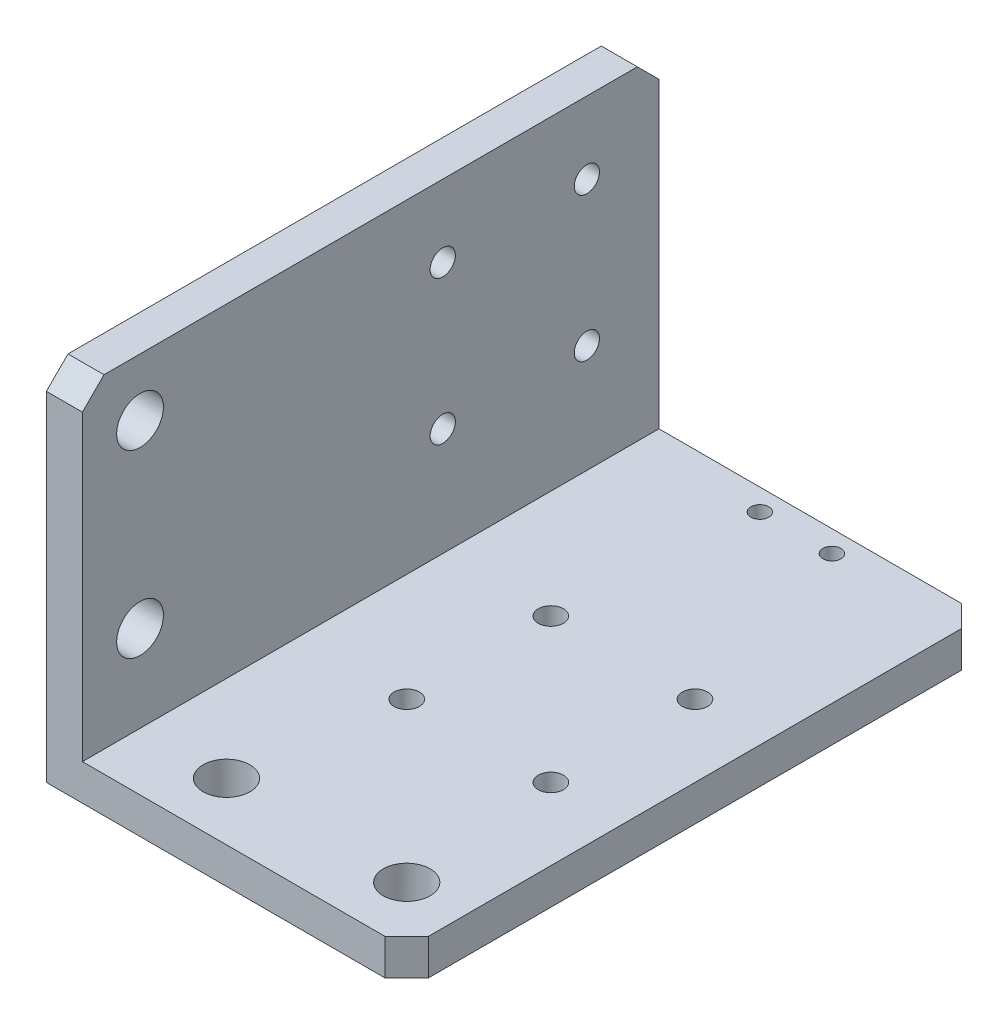
ISO-10303-21;
HEADER;
FILE_DESCRIPTION(('STEP AP214'),'2;1');
FILE_NAME('part.step','',(''),(''),'','','');
FILE_SCHEMA(('AUTOMOTIVE_DESIGN { 1 0 10303 214 1 1 1 1 }'));
ENDSEC;
DATA;
#1=APPLICATION_CONTEXT('core data for automotive mechanical design processes');
#2=APPLICATION_PROTOCOL_DEFINITION('international standard','automotive_design',2000,#1);
#3=PRODUCT_CONTEXT('',#1,'mechanical');
#4=PRODUCT('Part','Part','',(#3));
#5=PRODUCT_RELATED_PRODUCT_CATEGORY('part','',(#4));
#6=PRODUCT_DEFINITION_FORMATION('','',#4);
#7=PRODUCT_DEFINITION_CONTEXT('part definition',#1,'design');
#8=PRODUCT_DEFINITION('design','',#6,#7);
#9=PRODUCT_DEFINITION_SHAPE('','',#8);
#10=(LENGTH_UNIT() NAMED_UNIT(*) SI_UNIT(.MILLI.,.METRE.));
#11=(NAMED_UNIT(*) PLANE_ANGLE_UNIT() SI_UNIT($,.RADIAN.));
#12=(NAMED_UNIT(*) SI_UNIT($,.STERADIAN.) SOLID_ANGLE_UNIT());
#13=UNCERTAINTY_MEASURE_WITH_UNIT(LENGTH_MEASURE(1.E-05),#10,'distance_accuracy_value','');
#14=(GEOMETRIC_REPRESENTATION_CONTEXT(3) GLOBAL_UNCERTAINTY_ASSIGNED_CONTEXT((#13)) GLOBAL_UNIT_ASSIGNED_CONTEXT((#10,
#11,#12)) REPRESENTATION_CONTEXT('',''));
#15=CARTESIAN_POINT('',(0.,0.,0.));
#16=DIRECTION('',(0.,0.,1.));
#17=DIRECTION('',(1.,0.,0.));
#18=AXIS2_PLACEMENT_3D('',#15,#16,#17);
#19=CARTESIAN_POINT('',(50.,0.,80.));
#20=DIRECTION('',(0.,1.,0.));
#21=DIRECTION('',(-1.,0.,0.));
#22=AXIS2_PLACEMENT_3D('',#19,#20,#21);
#23=PLANE('',#22);
#24=CARTESIAN_POINT('',(22.,0.,3.));
#25=DIRECTION('',(0.,1.,0.));
#26=DIRECTION('',(-1.,0.,0.));
#27=AXIS2_PLACEMENT_3D('',#24,#25,#26);
#28=CIRCLE('',#27,1.25);
#29=CARTESIAN_POINT('',(20.75,0.,3.));
#30=VERTEX_POINT('',#29);
#31=EDGE_CURVE('E311',#30,#30,#28,.F.);
#32=ORIENTED_EDGE('',*,*,#31,.F.);
#33=EDGE_LOOP('',(#32));
#34=FACE_BOUND('',#33,.T.);
#35=CARTESIAN_POINT('',(32.,0.,3.));
#36=DIRECTION('',(0.,1.,0.));
#37=DIRECTION('',(-1.,0.,0.));
#38=AXIS2_PLACEMENT_3D('',#35,#36,#37);
#39=CIRCLE('',#38,1.25);
#40=CARTESIAN_POINT('',(30.75,0.,3.));
#41=VERTEX_POINT('',#40);
#42=EDGE_CURVE('E305',#41,#41,#39,.F.);
#43=ORIENTED_EDGE('',*,*,#42,.F.);
#44=EDGE_LOOP('',(#43));
#45=FACE_BOUND('',#44,.T.);
#46=CARTESIAN_POINT('',(40.0000000000001,0.,30.0000000000001));
#47=DIRECTION('',(0.,-1.,0.));
#48=DIRECTION('',(1.,0.,0.));
#49=AXIS2_PLACEMENT_3D('',#46,#47,#48);
#50=CIRCLE('',#49,1.75000000000001);
#51=CARTESIAN_POINT('',(41.7500000000001,0.,30.0000000000001));
#52=VERTEX_POINT('',#51);
#53=EDGE_CURVE('E302',#52,#52,#50,.T.);
#54=ORIENTED_EDGE('',*,*,#53,.F.);
#55=EDGE_LOOP('',(#54));
#56=FACE_BOUND('',#55,.T.);
#57=CARTESIAN_POINT('',(39.9999999999999,0.,50.0000000000001));
#58=DIRECTION('',(0.,-1.,0.));
#59=DIRECTION('',(1.,0.,0.));
#60=AXIS2_PLACEMENT_3D('',#57,#58,#59);
#61=CIRCLE('',#60,1.75);
#62=CARTESIAN_POINT('',(41.7499999999999,0.,50.0000000000001));
#63=VERTEX_POINT('',#62);
#64=EDGE_CURVE('E296',#63,#63,#61,.T.);
#65=ORIENTED_EDGE('',*,*,#64,.F.);
#66=EDGE_LOOP('',(#65));
#67=FACE_BOUND('',#66,.T.);
#68=CARTESIAN_POINT('',(19.9999999999999,0.,49.9999999999999));
#69=DIRECTION('',(0.,-1.,0.));
#70=DIRECTION('',(1.,0.,0.));
#71=AXIS2_PLACEMENT_3D('',#68,#69,#70);
#72=CIRCLE('',#71,1.75);
#73=CARTESIAN_POINT('',(21.7499999999999,0.,49.9999999999999));
#74=VERTEX_POINT('',#73);
#75=EDGE_CURVE('E290',#74,#74,#72,.T.);
#76=ORIENTED_EDGE('',*,*,#75,.F.);
#77=EDGE_LOOP('',(#76));
#78=FACE_BOUND('',#77,.T.);
#79=CARTESIAN_POINT('',(20.0000000000001,0.,29.9999999999999));
#80=DIRECTION('',(0.,-1.,0.));
#81=DIRECTION('',(1.,0.,0.));
#82=AXIS2_PLACEMENT_3D('',#79,#80,#81);
#83=CIRCLE('',#82,1.75);
#84=CARTESIAN_POINT('',(21.7500000000001,0.,29.9999999999999));
#85=VERTEX_POINT('',#84);
#86=EDGE_CURVE('E284',#85,#85,#83,.T.);
#87=ORIENTED_EDGE('',*,*,#86,.F.);
#88=EDGE_LOOP('',(#87));
#89=FACE_BOUND('',#88,.T.);
#90=CARTESIAN_POINT('',(17.,0.,72.));
#91=DIRECTION('',(0.,-1.,0.));
#92=DIRECTION('',(0.,0.,-1.));
#93=AXIS2_PLACEMENT_3D('',#90,#91,#92);
#94=CIRCLE('',#93,3.24999999999999);
#95=CARTESIAN_POINT('',(17.,0.,68.75));
#96=VERTEX_POINT('',#95);
#97=EDGE_CURVE('E242',#96,#96,#94,.T.);
#98=ORIENTED_EDGE('',*,*,#97,.F.);
#99=EDGE_LOOP('',(#98));
#100=FACE_BOUND('',#99,.T.);
#101=CARTESIAN_POINT('',(42.,0.,72.));
#102=DIRECTION('',(0.,-1.,0.));
#103=DIRECTION('',(0.,0.,-1.));
#104=AXIS2_PLACEMENT_3D('',#101,#102,#103);
#105=CIRCLE('',#104,3.24999999999999);
#106=CARTESIAN_POINT('',(42.,0.,68.75));
#107=VERTEX_POINT('',#106);
#108=EDGE_CURVE('E236',#107,#107,#105,.T.);
#109=ORIENTED_EDGE('',*,*,#108,.F.);
#110=EDGE_LOOP('',(#109));
#111=FACE_BOUND('',#110,.T.);
#112=DIRECTION('',(1.,0.,0.));
#113=VECTOR('',#112,1.);
#114=CARTESIAN_POINT('',(50.,0.,0.));
#115=LINE('',#114,#113);
#116=CARTESIAN_POINT('',(0.,0.,0.));
#117=VERTEX_POINT('',#116);
#118=CARTESIAN_POINT('',(47.,0.,0.));
#119=VERTEX_POINT('',#118);
#120=EDGE_CURVE('E160',#117,#119,#115,.T.);
#121=ORIENTED_EDGE('',*,*,#120,.T.);
#122=DIRECTION('',(0.707106781186548,0.,0.707106781186548));
#123=VECTOR('',#122,1.);
#124=CARTESIAN_POINT('',(50.,0.,3.00000000000002));
#125=LINE('',#124,#123);
#126=CARTESIAN_POINT('',(50.,0.,3.00000000000004));
#127=VERTEX_POINT('',#126);
#128=EDGE_CURVE('E205',#119,#127,#125,.T.);
#129=ORIENTED_EDGE('',*,*,#128,.T.);
#130=DIRECTION('',(0.,0.,-1.));
#131=VECTOR('',#130,1.);
#132=CARTESIAN_POINT('',(50.,0.,80.));
#133=LINE('',#132,#131);
#134=CARTESIAN_POINT('',(50.,0.,77.));
#135=VERTEX_POINT('',#134);
#136=EDGE_CURVE('E177',#135,#127,#133,.T.);
#137=ORIENTED_EDGE('',*,*,#136,.F.);
#138=DIRECTION('',(0.707106781186544,0.,-0.707106781186551));
#139=VECTOR('',#138,1.);
#140=CARTESIAN_POINT('',(47.,0.,80.));
#141=LINE('',#140,#139);
#142=CARTESIAN_POINT('',(47.,0.,80.));
#143=VERTEX_POINT('',#142);
#144=EDGE_CURVE('E64',#135,#143,#141,.F.);
#145=ORIENTED_EDGE('',*,*,#144,.T.);
#146=DIRECTION('',(1.,0.,0.));
#147=VECTOR('',#146,1.);
#148=CARTESIAN_POINT('',(50.,0.,80.));
#149=LINE('',#148,#147);
#150=CARTESIAN_POINT('',(0.,0.,80.));
#151=VERTEX_POINT('',#150);
#152=EDGE_CURVE('E136',#151,#143,#149,.T.);
#153=ORIENTED_EDGE('',*,*,#152,.F.);
#154=DIRECTION('',(0.,0.,-1.));
#155=VECTOR('',#154,1.);
#156=CARTESIAN_POINT('',(0.,0.,80.));
#157=LINE('',#156,#155);
#158=EDGE_CURVE('E156',#151,#117,#157,.T.);
#159=ORIENTED_EDGE('',*,*,#158,.T.);
#160=EDGE_LOOP('',(#121,#129,#137,#145,#153,#159));
#161=FACE_BOUND('',#160,.T.);
#162=ADVANCED_FACE('F49',(#34,#45,#56,#67,#78,#89,#100,#111,#161),#23,.F.);
#163=CARTESIAN_POINT('',(50.,5.,80.));
#164=DIRECTION('',(-1.,0.,0.));
#165=DIRECTION('',(0.,0.,1.));
#166=AXIS2_PLACEMENT_3D('',#163,#164,#165);
#167=PLANE('',#166);
#168=ORIENTED_EDGE('',*,*,#136,.T.);
#169=DIRECTION('',(0.,1.,0.));
#170=VECTOR('',#169,1.);
#171=CARTESIAN_POINT('',(50.,5.,3.00000000000002));
#172=LINE('',#171,#170);
#173=CARTESIAN_POINT('',(50.,5.,3.00000000000004));
#174=VERTEX_POINT('',#173);
#175=EDGE_CURVE('E198',#127,#174,#172,.T.);
#176=ORIENTED_EDGE('',*,*,#175,.T.);
#177=DIRECTION('',(0.,0.,-1.));
#178=VECTOR('',#177,1.);
#179=CARTESIAN_POINT('',(50.,5.,80.));
#180=LINE('',#179,#178);
#181=CARTESIAN_POINT('',(50.,5.,77.));
#182=VERTEX_POINT('',#181);
#183=EDGE_CURVE('E147',#182,#174,#180,.T.);
#184=ORIENTED_EDGE('',*,*,#183,.F.);
#185=DIRECTION('',(0.,-1.,0.));
#186=VECTOR('',#185,1.);
#187=CARTESIAN_POINT('',(50.,5.,77.));
#188=LINE('',#187,#186);
#189=EDGE_CURVE('E196',#182,#135,#188,.T.);
#190=ORIENTED_EDGE('',*,*,#189,.T.);
#191=EDGE_LOOP('',(#168,#176,#184,#190));
#192=FACE_BOUND('',#191,.T.);
#193=ADVANCED_FACE('F212',(#192),#167,.F.);
#194=CARTESIAN_POINT('',(5.00000000000001,5.,80.));
#195=DIRECTION('',(0.,-1.,0.));
#196=DIRECTION('',(1.,0.,0.));
#197=AXIS2_PLACEMENT_3D('',#194,#195,#196);
#198=PLANE('',#197);
#199=CARTESIAN_POINT('',(22.,5.,3.));
#200=DIRECTION('',(0.,1.,0.));
#201=DIRECTION('',(-1.,0.,0.));
#202=AXIS2_PLACEMENT_3D('',#199,#200,#201);
#203=CIRCLE('',#202,1.25);
#204=CARTESIAN_POINT('',(20.75,5.,3.));
#205=VERTEX_POINT('',#204);
#206=EDGE_CURVE('E314',#205,#205,#203,.T.);
#207=ORIENTED_EDGE('',*,*,#206,.F.);
#208=EDGE_LOOP('',(#207));
#209=FACE_BOUND('',#208,.T.);
#210=CARTESIAN_POINT('',(32.,5.,3.));
#211=DIRECTION('',(0.,1.,0.));
#212=DIRECTION('',(-1.,0.,0.));
#213=AXIS2_PLACEMENT_3D('',#210,#211,#212);
#214=CIRCLE('',#213,1.25);
#215=CARTESIAN_POINT('',(30.75,5.,3.));
#216=VERTEX_POINT('',#215);
#217=EDGE_CURVE('E308',#216,#216,#214,.T.);
#218=ORIENTED_EDGE('',*,*,#217,.F.);
#219=EDGE_LOOP('',(#218));
#220=FACE_BOUND('',#219,.T.);
#221=CARTESIAN_POINT('',(40.0000000000001,5.,30.0000000000001));
#222=DIRECTION('',(0.,-1.,0.));
#223=DIRECTION('',(1.,0.,0.));
#224=AXIS2_PLACEMENT_3D('',#221,#222,#223);
#225=CIRCLE('',#224,1.75000000000001);
#226=CARTESIAN_POINT('',(41.7500000000001,5.,30.0000000000001));
#227=VERTEX_POINT('',#226);
#228=EDGE_CURVE('E299',#227,#227,#225,.F.);
#229=ORIENTED_EDGE('',*,*,#228,.F.);
#230=EDGE_LOOP('',(#229));
#231=FACE_BOUND('',#230,.T.);
#232=CARTESIAN_POINT('',(39.9999999999999,5.,50.0000000000001));
#233=DIRECTION('',(0.,-1.,0.));
#234=DIRECTION('',(1.,0.,0.));
#235=AXIS2_PLACEMENT_3D('',#232,#233,#234);
#236=CIRCLE('',#235,1.75);
#237=CARTESIAN_POINT('',(41.7499999999999,5.,50.0000000000001));
#238=VERTEX_POINT('',#237);
#239=EDGE_CURVE('E293',#238,#238,#236,.F.);
#240=ORIENTED_EDGE('',*,*,#239,.F.);
#241=EDGE_LOOP('',(#240));
#242=FACE_BOUND('',#241,.T.);
#243=CARTESIAN_POINT('',(19.9999999999999,5.,49.9999999999999));
#244=DIRECTION('',(0.,-1.,0.));
#245=DIRECTION('',(1.,0.,0.));
#246=AXIS2_PLACEMENT_3D('',#243,#244,#245);
#247=CIRCLE('',#246,1.75);
#248=CARTESIAN_POINT('',(21.7499999999999,5.,49.9999999999999));
#249=VERTEX_POINT('',#248);
#250=EDGE_CURVE('E287',#249,#249,#247,.F.);
#251=ORIENTED_EDGE('',*,*,#250,.F.);
#252=EDGE_LOOP('',(#251));
#253=FACE_BOUND('',#252,.T.);
#254=CARTESIAN_POINT('',(20.0000000000001,5.,29.9999999999999));
#255=DIRECTION('',(0.,-1.,0.));
#256=DIRECTION('',(1.,0.,0.));
#257=AXIS2_PLACEMENT_3D('',#254,#255,#256);
#258=CIRCLE('',#257,1.75);
#259=CARTESIAN_POINT('',(21.7500000000001,5.,29.9999999999999));
#260=VERTEX_POINT('',#259);
#261=EDGE_CURVE('E281',#260,#260,#258,.F.);
#262=ORIENTED_EDGE('',*,*,#261,.F.);
#263=EDGE_LOOP('',(#262));
#264=FACE_BOUND('',#263,.T.);
#265=CARTESIAN_POINT('',(17.,5.,72.));
#266=DIRECTION('',(0.,-1.,0.));
#267=DIRECTION('',(1.,0.,0.));
#268=AXIS2_PLACEMENT_3D('',#265,#266,#267);
#269=CIRCLE('',#268,3.24999999999999);
#270=CARTESIAN_POINT('',(20.25,5.,72.));
#271=VERTEX_POINT('',#270);
#272=EDGE_CURVE('E239',#271,#271,#269,.T.);
#273=ORIENTED_EDGE('',*,*,#272,.T.);
#274=EDGE_LOOP('',(#273));
#275=FACE_BOUND('',#274,.T.);
#276=CARTESIAN_POINT('',(42.,5.,72.));
#277=DIRECTION('',(0.,-1.,0.));
#278=DIRECTION('',(1.,0.,0.));
#279=AXIS2_PLACEMENT_3D('',#276,#277,#278);
#280=CIRCLE('',#279,3.24999999999999);
#281=CARTESIAN_POINT('',(45.25,5.,72.));
#282=VERTEX_POINT('',#281);
#283=EDGE_CURVE('E163',#282,#282,#280,.T.);
#284=ORIENTED_EDGE('',*,*,#283,.T.);
#285=EDGE_LOOP('',(#284));
#286=FACE_BOUND('',#285,.T.);
#287=ORIENTED_EDGE('',*,*,#183,.T.);
#288=DIRECTION('',(-0.707106781186548,0.,-0.707106781186548));
#289=VECTOR('',#288,1.);
#290=CARTESIAN_POINT('',(50.,5.,3.00000000000002));
#291=LINE('',#290,#289);
#292=CARTESIAN_POINT('',(47.,5.,0.));
#293=VERTEX_POINT('',#292);
#294=EDGE_CURVE('E202',#174,#293,#291,.T.);
#295=ORIENTED_EDGE('',*,*,#294,.T.);
#296=DIRECTION('',(-1.,0.,0.));
#297=VECTOR('',#296,1.);
#298=CARTESIAN_POINT('',(5.00000000000001,5.,0.));
#299=LINE('',#298,#297);
#300=CARTESIAN_POINT('',(5.00000000000001,5.,0.));
#301=VERTEX_POINT('',#300);
#302=EDGE_CURVE('E143',#293,#301,#299,.T.);
#303=ORIENTED_EDGE('',*,*,#302,.T.);
#304=DIRECTION('',(0.,0.,-1.));
#305=VECTOR('',#304,1.);
#306=CARTESIAN_POINT('',(5.00000000000001,5.,80.));
#307=LINE('',#306,#305);
#308=CARTESIAN_POINT('',(5.00000000000001,5.,80.));
#309=VERTEX_POINT('',#308);
#310=EDGE_CURVE('E139',#309,#301,#307,.T.);
#311=ORIENTED_EDGE('',*,*,#310,.F.);
#312=DIRECTION('',(-1.,0.,0.));
#313=VECTOR('',#312,1.);
#314=CARTESIAN_POINT('',(5.00000000000001,5.,80.));
#315=LINE('',#314,#313);
#316=CARTESIAN_POINT('',(47.,5.,80.));
#317=VERTEX_POINT('',#316);
#318=EDGE_CURVE('E129',#317,#309,#315,.T.);
#319=ORIENTED_EDGE('',*,*,#318,.F.);
#320=DIRECTION('',(-0.707106781186544,0.,0.707106781186551));
#321=VECTOR('',#320,1.);
#322=CARTESIAN_POINT('',(47.,5.,80.));
#323=LINE('',#322,#321);
#324=EDGE_CURVE('E72',#317,#182,#323,.F.);
#325=ORIENTED_EDGE('',*,*,#324,.T.);
#326=EDGE_LOOP('',(#287,#295,#303,#311,#319,#325));
#327=FACE_BOUND('',#326,.T.);
#328=ADVANCED_FACE('F141',(#209,#220,#231,#242,#253,#264,#275,#286,#327),#198,.F.);
#329=CARTESIAN_POINT('',(5.,50.,80.));
#330=DIRECTION('',(-1.,0.,0.));
#331=DIRECTION('',(0.,-1.,0.));
#332=AXIS2_PLACEMENT_3D('',#329,#330,#331);
#333=PLANE('',#332);
#334=CARTESIAN_POINT('',(5.,20.,10.0000000000001));
#335=DIRECTION('',(-1.,0.,0.));
#336=DIRECTION('',(0.,-1.,0.));
#337=AXIS2_PLACEMENT_3D('',#334,#335,#336);
#338=CIRCLE('',#337,1.75);
#339=CARTESIAN_POINT('',(5.,18.25,10.0000000000001));
#340=VERTEX_POINT('',#339);
#341=EDGE_CURVE('E275',#340,#340,#338,.F.);
#342=ORIENTED_EDGE('',*,*,#341,.F.);
#343=EDGE_LOOP('',(#342));
#344=FACE_BOUND('',#343,.T.);
#345=CARTESIAN_POINT('',(5.,20.,30.));
#346=DIRECTION('',(-1.,0.,0.));
#347=DIRECTION('',(0.,-1.,0.));
#348=AXIS2_PLACEMENT_3D('',#345,#346,#347);
#349=CIRCLE('',#348,1.75);
#350=CARTESIAN_POINT('',(5.,18.25,30.));
#351=VERTEX_POINT('',#350);
#352=EDGE_CURVE('E269',#351,#351,#349,.F.);
#353=ORIENTED_EDGE('',*,*,#352,.F.);
#354=EDGE_LOOP('',(#353));
#355=FACE_BOUND('',#354,.T.);
#356=CARTESIAN_POINT('',(5.,40.,30.));
#357=DIRECTION('',(-1.,0.,0.));
#358=DIRECTION('',(0.,-1.,0.));
#359=AXIS2_PLACEMENT_3D('',#356,#357,#358);
#360=CIRCLE('',#359,1.75);
#361=CARTESIAN_POINT('',(5.,38.25,30.));
#362=VERTEX_POINT('',#361);
#363=EDGE_CURVE('E263',#362,#362,#360,.F.);
#364=ORIENTED_EDGE('',*,*,#363,.F.);
#365=EDGE_LOOP('',(#364));
#366=FACE_BOUND('',#365,.T.);
#367=CARTESIAN_POINT('',(5.,40.,10.));
#368=DIRECTION('',(-1.,0.,0.));
#369=DIRECTION('',(0.,-1.,0.));
#370=AXIS2_PLACEMENT_3D('',#367,#368,#369);
#371=CIRCLE('',#370,1.75);
#372=CARTESIAN_POINT('',(5.,38.25,10.));
#373=VERTEX_POINT('',#372);
#374=EDGE_CURVE('E257',#373,#373,#371,.F.);
#375=ORIENTED_EDGE('',*,*,#374,.F.);
#376=EDGE_LOOP('',(#375));
#377=FACE_BOUND('',#376,.T.);
#378=CARTESIAN_POINT('',(5.,42.,72.));
#379=DIRECTION('',(-1.,0.,0.));
#380=DIRECTION('',(0.,0.,1.));
#381=AXIS2_PLACEMENT_3D('',#378,#379,#380);
#382=CIRCLE('',#381,3.25);
#383=CARTESIAN_POINT('',(5.,42.,75.25));
#384=VERTEX_POINT('',#383);
#385=EDGE_CURVE('E251',#384,#384,#382,.T.);
#386=ORIENTED_EDGE('',*,*,#385,.T.);
#387=EDGE_LOOP('',(#386));
#388=FACE_BOUND('',#387,.T.);
#389=CARTESIAN_POINT('',(5.,17.,72.));
#390=DIRECTION('',(-1.,0.,0.));
#391=DIRECTION('',(0.,0.,1.));
#392=AXIS2_PLACEMENT_3D('',#389,#390,#391);
#393=CIRCLE('',#392,3.25);
#394=CARTESIAN_POINT('',(5.,17.,75.25));
#395=VERTEX_POINT('',#394);
#396=EDGE_CURVE('E245',#395,#395,#393,.T.);
#397=ORIENTED_EDGE('',*,*,#396,.T.);
#398=EDGE_LOOP('',(#397));
#399=FACE_BOUND('',#398,.T.);
#400=DIRECTION('',(0.,1.,0.));
#401=VECTOR('',#400,1.);
#402=CARTESIAN_POINT('',(5.,50.,0.));
#403=LINE('',#402,#401);
#404=CARTESIAN_POINT('',(5.,47.,0.));
#405=VERTEX_POINT('',#404);
#406=EDGE_CURVE('E165',#301,#405,#403,.T.);
#407=ORIENTED_EDGE('',*,*,#406,.T.);
#408=DIRECTION('',(0.,0.707106781186548,0.707106781186548));
#409=VECTOR('',#408,1.);
#410=CARTESIAN_POINT('',(5.,50.,3.00000000000002));
#411=LINE('',#410,#409);
#412=CARTESIAN_POINT('',(5.,50.,3.00000000000004));
#413=VERTEX_POINT('',#412);
#414=EDGE_CURVE('E194',#405,#413,#411,.T.);
#415=ORIENTED_EDGE('',*,*,#414,.T.);
#416=DIRECTION('',(0.,0.,-1.));
#417=VECTOR('',#416,1.);
#418=CARTESIAN_POINT('',(5.,50.,80.));
#419=LINE('',#418,#417);
#420=CARTESIAN_POINT('',(5.,50.,77.));
#421=VERTEX_POINT('',#420);
#422=EDGE_CURVE('E148',#421,#413,#419,.T.);
#423=ORIENTED_EDGE('',*,*,#422,.F.);
#424=DIRECTION('',(0.,0.707106781186544,-0.707106781186551));
#425=VECTOR('',#424,1.);
#426=CARTESIAN_POINT('',(5.,47.,80.));
#427=LINE('',#426,#425);
#428=CARTESIAN_POINT('',(5.,47.,80.));
#429=VERTEX_POINT('',#428);
#430=EDGE_CURVE('E153',#421,#429,#427,.F.);
#431=ORIENTED_EDGE('',*,*,#430,.T.);
#432=DIRECTION('',(0.,1.,0.));
#433=VECTOR('',#432,1.);
#434=CARTESIAN_POINT('',(5.,50.,80.));
#435=LINE('',#434,#433);
#436=EDGE_CURVE('E133',#309,#429,#435,.T.);
#437=ORIENTED_EDGE('',*,*,#436,.F.);
#438=ORIENTED_EDGE('',*,*,#310,.T.);
#439=EDGE_LOOP('',(#407,#415,#423,#431,#437,#438));
#440=FACE_BOUND('',#439,.T.);
#441=ADVANCED_FACE('F150',(#344,#355,#366,#377,#388,#399,#440),#333,.F.);
#442=CARTESIAN_POINT('',(0.,50.,80.));
#443=DIRECTION('',(0.,-1.,0.));
#444=DIRECTION('',(0.,0.,-1.));
#445=AXIS2_PLACEMENT_3D('',#442,#443,#444);
#446=PLANE('',#445);
#447=ORIENTED_EDGE('',*,*,#422,.T.);
#448=DIRECTION('',(-1.,0.,0.));
#449=VECTOR('',#448,1.);
#450=CARTESIAN_POINT('',(0.,50.,3.00000000000002));
#451=LINE('',#450,#449);
#452=CARTESIAN_POINT('',(0.,50.,3.00000000000004));
#453=VERTEX_POINT('',#452);
#454=EDGE_CURVE('E182',#413,#453,#451,.T.);
#455=ORIENTED_EDGE('',*,*,#454,.T.);
#456=DIRECTION('',(0.,0.,-1.));
#457=VECTOR('',#456,1.);
#458=CARTESIAN_POINT('',(0.,50.,80.));
#459=LINE('',#458,#457);
#460=CARTESIAN_POINT('',(0.,50.,77.));
#461=VERTEX_POINT('',#460);
#462=EDGE_CURVE('E171',#461,#453,#459,.T.);
#463=ORIENTED_EDGE('',*,*,#462,.F.);
#464=DIRECTION('',(1.,0.,0.));
#465=VECTOR('',#464,1.);
#466=CARTESIAN_POINT('',(0.,50.,77.));
#467=LINE('',#466,#465);
#468=EDGE_CURVE('E180',#461,#421,#467,.T.);
#469=ORIENTED_EDGE('',*,*,#468,.T.);
#470=EDGE_LOOP('',(#447,#455,#463,#469));
#471=FACE_BOUND('',#470,.T.);
#472=ADVANCED_FACE('F225',(#471),#446,.F.);
#473=CARTESIAN_POINT('',(0.,0.,80.));
#474=DIRECTION('',(1.,0.,0.));
#475=DIRECTION('',(0.,0.,-1.));
#476=AXIS2_PLACEMENT_3D('',#473,#474,#475);
#477=PLANE('',#476);
#478=CARTESIAN_POINT('',(0.,20.,10.0000000000001));
#479=DIRECTION('',(-1.,0.,0.));
#480=DIRECTION('',(0.,0.,1.));
#481=AXIS2_PLACEMENT_3D('',#478,#479,#480);
#482=CIRCLE('',#481,1.75);
#483=CARTESIAN_POINT('',(0.,20.,11.7500000000001));
#484=VERTEX_POINT('',#483);
#485=EDGE_CURVE('E278',#484,#484,#482,.T.);
#486=ORIENTED_EDGE('',*,*,#485,.F.);
#487=EDGE_LOOP('',(#486));
#488=FACE_BOUND('',#487,.T.);
#489=CARTESIAN_POINT('',(0.,20.,30.));
#490=DIRECTION('',(-1.,0.,0.));
#491=DIRECTION('',(0.,0.,1.));
#492=AXIS2_PLACEMENT_3D('',#489,#490,#491);
#493=CIRCLE('',#492,1.75);
#494=CARTESIAN_POINT('',(0.,20.,31.75));
#495=VERTEX_POINT('',#494);
#496=EDGE_CURVE('E272',#495,#495,#493,.T.);
#497=ORIENTED_EDGE('',*,*,#496,.F.);
#498=EDGE_LOOP('',(#497));
#499=FACE_BOUND('',#498,.T.);
#500=CARTESIAN_POINT('',(0.,40.,30.));
#501=DIRECTION('',(-1.,0.,0.));
#502=DIRECTION('',(0.,0.,1.));
#503=AXIS2_PLACEMENT_3D('',#500,#501,#502);
#504=CIRCLE('',#503,1.75);
#505=CARTESIAN_POINT('',(0.,40.,31.75));
#506=VERTEX_POINT('',#505);
#507=EDGE_CURVE('E266',#506,#506,#504,.T.);
#508=ORIENTED_EDGE('',*,*,#507,.F.);
#509=EDGE_LOOP('',(#508));
#510=FACE_BOUND('',#509,.T.);
#511=CARTESIAN_POINT('',(0.,40.,10.));
#512=DIRECTION('',(-1.,0.,0.));
#513=DIRECTION('',(0.,0.,1.));
#514=AXIS2_PLACEMENT_3D('',#511,#512,#513);
#515=CIRCLE('',#514,1.75);
#516=CARTESIAN_POINT('',(0.,40.,11.75));
#517=VERTEX_POINT('',#516);
#518=EDGE_CURVE('E260',#517,#517,#515,.T.);
#519=ORIENTED_EDGE('',*,*,#518,.F.);
#520=EDGE_LOOP('',(#519));
#521=FACE_BOUND('',#520,.T.);
#522=CARTESIAN_POINT('',(0.,42.,72.));
#523=DIRECTION('',(-1.,0.,0.));
#524=DIRECTION('',(0.,0.,1.));
#525=AXIS2_PLACEMENT_3D('',#522,#523,#524);
#526=CIRCLE('',#525,3.24999999999999);
#527=CARTESIAN_POINT('',(0.,42.,75.25));
#528=VERTEX_POINT('',#527);
#529=EDGE_CURVE('E254',#528,#528,#526,.T.);
#530=ORIENTED_EDGE('',*,*,#529,.F.);
#531=EDGE_LOOP('',(#530));
#532=FACE_BOUND('',#531,.T.);
#533=CARTESIAN_POINT('',(0.,17.,72.));
#534=DIRECTION('',(-1.,0.,0.));
#535=DIRECTION('',(0.,0.,1.));
#536=AXIS2_PLACEMENT_3D('',#533,#534,#535);
#537=CIRCLE('',#536,3.24999999999999);
#538=CARTESIAN_POINT('',(0.,17.,75.25));
#539=VERTEX_POINT('',#538);
#540=EDGE_CURVE('E248',#539,#539,#537,.T.);
#541=ORIENTED_EDGE('',*,*,#540,.F.);
#542=EDGE_LOOP('',(#541));
#543=FACE_BOUND('',#542,.T.);
#544=ORIENTED_EDGE('',*,*,#462,.T.);
#545=DIRECTION('',(0.,-0.707106781186548,-0.707106781186548));
#546=VECTOR('',#545,1.);
#547=CARTESIAN_POINT('',(0.,50.,3.00000000000002));
#548=LINE('',#547,#546);
#549=CARTESIAN_POINT('',(0.,47.,0.));
#550=VERTEX_POINT('',#549);
#551=EDGE_CURVE('E187',#453,#550,#548,.T.);
#552=ORIENTED_EDGE('',*,*,#551,.T.);
#553=DIRECTION('',(0.,-1.,0.));
#554=VECTOR('',#553,1.);
#555=CARTESIAN_POINT('',(0.,0.,0.));
#556=LINE('',#555,#554);
#557=EDGE_CURVE('E167',#550,#117,#556,.T.);
#558=ORIENTED_EDGE('',*,*,#557,.T.);
#559=ORIENTED_EDGE('',*,*,#158,.F.);
#560=DIRECTION('',(0.,-1.,0.));
#561=VECTOR('',#560,1.);
#562=CARTESIAN_POINT('',(0.,0.,80.));
#563=LINE('',#562,#561);
#564=CARTESIAN_POINT('',(0.,47.,80.));
#565=VERTEX_POINT('',#564);
#566=EDGE_CURVE('E154',#565,#151,#563,.T.);
#567=ORIENTED_EDGE('',*,*,#566,.F.);
#568=DIRECTION('',(0.,-0.707106781186544,0.707106781186551));
#569=VECTOR('',#568,1.);
#570=CARTESIAN_POINT('',(0.,47.,80.));
#571=LINE('',#570,#569);
#572=EDGE_CURVE('E185',#565,#461,#571,.F.);
#573=ORIENTED_EDGE('',*,*,#572,.T.);
#574=EDGE_LOOP('',(#544,#552,#558,#559,#567,#573));
#575=FACE_BOUND('',#574,.T.);
#576=ADVANCED_FACE('F228',(#488,#499,#510,#521,#532,#543,#575),#477,.F.);
#577=CARTESIAN_POINT('',(0.,0.,80.));
#578=DIRECTION('',(0.,0.,-1.));
#579=DIRECTION('',(-1.,0.,0.));
#580=AXIS2_PLACEMENT_3D('',#577,#578,#579);
#581=PLANE('',#580);
#582=ORIENTED_EDGE('',*,*,#436,.T.);
#583=DIRECTION('',(-1.,0.,0.));
#584=VECTOR('',#583,1.);
#585=CARTESIAN_POINT('',(0.,47.,80.));
#586=LINE('',#585,#584);
#587=EDGE_CURVE('E13',#429,#565,#586,.T.);
#588=ORIENTED_EDGE('',*,*,#587,.T.);
#589=ORIENTED_EDGE('',*,*,#566,.T.);
#590=ORIENTED_EDGE('',*,*,#152,.T.);
#591=DIRECTION('',(0.,1.,0.));
#592=VECTOR('',#591,1.);
#593=CARTESIAN_POINT('',(47.,0.,80.));
#594=LINE('',#593,#592);
#595=EDGE_CURVE('E57',#143,#317,#594,.T.);
#596=ORIENTED_EDGE('',*,*,#595,.T.);
#597=ORIENTED_EDGE('',*,*,#318,.T.);
#598=EDGE_LOOP('',(#582,#588,#589,#590,#596,#597));
#599=FACE_BOUND('',#598,.T.);
#600=ADVANCED_FACE('F131',(#599),#581,.F.);
#601=CARTESIAN_POINT('',(0.,0.,0.));
#602=DIRECTION('',(0.,0.,-1.));
#603=DIRECTION('',(-1.,0.,0.));
#604=AXIS2_PLACEMENT_3D('',#601,#602,#603);
#605=PLANE('',#604);
#606=ORIENTED_EDGE('',*,*,#557,.F.);
#607=DIRECTION('',(1.,0.,0.));
#608=VECTOR('',#607,1.);
#609=CARTESIAN_POINT('',(5.,47.,0.));
#610=LINE('',#609,#608);
#611=EDGE_CURVE('E191',#550,#405,#610,.T.);
#612=ORIENTED_EDGE('',*,*,#611,.T.);
#613=ORIENTED_EDGE('',*,*,#406,.F.);
#614=ORIENTED_EDGE('',*,*,#302,.F.);
#615=DIRECTION('',(0.,-1.,0.));
#616=VECTOR('',#615,1.);
#617=CARTESIAN_POINT('',(47.,0.,0.));
#618=LINE('',#617,#616);
#619=EDGE_CURVE('E189',#293,#119,#618,.T.);
#620=ORIENTED_EDGE('',*,*,#619,.T.);
#621=ORIENTED_EDGE('',*,*,#120,.F.);
#622=EDGE_LOOP('',(#606,#612,#613,#614,#620,#621));
#623=FACE_BOUND('',#622,.T.);
#624=ADVANCED_FACE('F217',(#623),#605,.T.);
#625=CARTESIAN_POINT('',(42.,0.,72.));
#626=DIRECTION('',(0.,-1.,0.));
#627=DIRECTION('',(0.,0.,-1.));
#628=AXIS2_PLACEMENT_3D('',#625,#626,#627);
#629=CYLINDRICAL_SURFACE('',#628,3.24999999999999);
#630=ORIENTED_EDGE('',*,*,#108,.T.);
#631=EDGE_LOOP('',(#630));
#632=FACE_BOUND('',#631,.T.);
#633=ORIENTED_EDGE('',*,*,#283,.F.);
#634=EDGE_LOOP('',(#633));
#635=FACE_BOUND('',#634,.T.);
#636=ADVANCED_FACE('F338',(#632,#635),#629,.F.);
#637=CARTESIAN_POINT('',(17.,0.,72.));
#638=DIRECTION('',(0.,-1.,0.));
#639=DIRECTION('',(0.,0.,-1.));
#640=AXIS2_PLACEMENT_3D('',#637,#638,#639);
#641=CYLINDRICAL_SURFACE('',#640,3.24999999999999);
#642=ORIENTED_EDGE('',*,*,#97,.T.);
#643=EDGE_LOOP('',(#642));
#644=FACE_BOUND('',#643,.T.);
#645=ORIENTED_EDGE('',*,*,#272,.F.);
#646=EDGE_LOOP('',(#645));
#647=FACE_BOUND('',#646,.T.);
#648=ADVANCED_FACE('F340',(#644,#647),#641,.F.);
#649=CARTESIAN_POINT('',(0.,17.,72.));
#650=DIRECTION('',(-1.,0.,0.));
#651=DIRECTION('',(0.,0.,1.));
#652=AXIS2_PLACEMENT_3D('',#649,#650,#651);
#653=CYLINDRICAL_SURFACE('',#652,3.24999999999999);
#654=ORIENTED_EDGE('',*,*,#396,.F.);
#655=EDGE_LOOP('',(#654));
#656=FACE_BOUND('',#655,.T.);
#657=ORIENTED_EDGE('',*,*,#540,.T.);
#658=EDGE_LOOP('',(#657));
#659=FACE_BOUND('',#658,.T.);
#660=ADVANCED_FACE('F347',(#656,#659),#653,.F.);
#661=CARTESIAN_POINT('',(0.,42.,72.));
#662=DIRECTION('',(-1.,0.,0.));
#663=DIRECTION('',(0.,0.,1.));
#664=AXIS2_PLACEMENT_3D('',#661,#662,#663);
#665=CYLINDRICAL_SURFACE('',#664,3.24999999999999);
#666=ORIENTED_EDGE('',*,*,#385,.F.);
#667=EDGE_LOOP('',(#666));
#668=FACE_BOUND('',#667,.T.);
#669=ORIENTED_EDGE('',*,*,#529,.T.);
#670=EDGE_LOOP('',(#669));
#671=FACE_BOUND('',#670,.T.);
#672=ADVANCED_FACE('F412',(#668,#671),#665,.F.);
#673=CARTESIAN_POINT('',(50.001,40.,10.));
#674=DIRECTION('',(-1.,0.,0.));
#675=DIRECTION('',(0.,0.,1.));
#676=AXIS2_PLACEMENT_3D('',#673,#674,#675);
#677=CYLINDRICAL_SURFACE('',#676,1.75);
#678=ORIENTED_EDGE('',*,*,#518,.T.);
#679=EDGE_LOOP('',(#678));
#680=FACE_BOUND('',#679,.T.);
#681=ORIENTED_EDGE('',*,*,#374,.T.);
#682=EDGE_LOOP('',(#681));
#683=FACE_BOUND('',#682,.T.);
#684=ADVANCED_FACE('F408',(#680,#683),#677,.F.);
#685=CARTESIAN_POINT('',(50.001,40.,30.));
#686=DIRECTION('',(-1.,0.,0.));
#687=DIRECTION('',(0.,0.,1.));
#688=AXIS2_PLACEMENT_3D('',#685,#686,#687);
#689=CYLINDRICAL_SURFACE('',#688,1.75);
#690=ORIENTED_EDGE('',*,*,#507,.T.);
#691=EDGE_LOOP('',(#690));
#692=FACE_BOUND('',#691,.T.);
#693=ORIENTED_EDGE('',*,*,#363,.T.);
#694=EDGE_LOOP('',(#693));
#695=FACE_BOUND('',#694,.T.);
#696=ADVANCED_FACE('F404',(#692,#695),#689,.F.);
#697=CARTESIAN_POINT('',(50.001,20.,30.));
#698=DIRECTION('',(-1.,0.,0.));
#699=DIRECTION('',(0.,0.,1.));
#700=AXIS2_PLACEMENT_3D('',#697,#698,#699);
#701=CYLINDRICAL_SURFACE('',#700,1.75);
#702=ORIENTED_EDGE('',*,*,#496,.T.);
#703=EDGE_LOOP('',(#702));
#704=FACE_BOUND('',#703,.T.);
#705=ORIENTED_EDGE('',*,*,#352,.T.);
#706=EDGE_LOOP('',(#705));
#707=FACE_BOUND('',#706,.T.);
#708=ADVANCED_FACE('F400',(#704,#707),#701,.F.);
#709=CARTESIAN_POINT('',(50.001,20.,10.0000000000001));
#710=DIRECTION('',(-1.,0.,0.));
#711=DIRECTION('',(0.,0.,1.));
#712=AXIS2_PLACEMENT_3D('',#709,#710,#711);
#713=CYLINDRICAL_SURFACE('',#712,1.75);
#714=ORIENTED_EDGE('',*,*,#485,.T.);
#715=EDGE_LOOP('',(#714));
#716=FACE_BOUND('',#715,.T.);
#717=ORIENTED_EDGE('',*,*,#341,.T.);
#718=EDGE_LOOP('',(#717));
#719=FACE_BOUND('',#718,.T.);
#720=ADVANCED_FACE('F396',(#716,#719),#713,.F.);
#721=CARTESIAN_POINT('',(20.0000000000001,50.001,29.9999999999999));
#722=DIRECTION('',(0.,-1.,0.));
#723=DIRECTION('',(1.,0.,0.));
#724=AXIS2_PLACEMENT_3D('',#721,#722,#723);
#725=CYLINDRICAL_SURFACE('',#724,1.75);
#726=ORIENTED_EDGE('',*,*,#86,.T.);
#727=EDGE_LOOP('',(#726));
#728=FACE_BOUND('',#727,.T.);
#729=ORIENTED_EDGE('',*,*,#261,.T.);
#730=EDGE_LOOP('',(#729));
#731=FACE_BOUND('',#730,.T.);
#732=ADVANCED_FACE('F392',(#728,#731),#725,.F.);
#733=CARTESIAN_POINT('',(19.9999999999999,50.001,49.9999999999999));
#734=DIRECTION('',(0.,-1.,0.));
#735=DIRECTION('',(1.,0.,0.));
#736=AXIS2_PLACEMENT_3D('',#733,#734,#735);
#737=CYLINDRICAL_SURFACE('',#736,1.75);
#738=ORIENTED_EDGE('',*,*,#75,.T.);
#739=EDGE_LOOP('',(#738));
#740=FACE_BOUND('',#739,.T.);
#741=ORIENTED_EDGE('',*,*,#250,.T.);
#742=EDGE_LOOP('',(#741));
#743=FACE_BOUND('',#742,.T.);
#744=ADVANCED_FACE('F388',(#740,#743),#737,.F.);
#745=CARTESIAN_POINT('',(39.9999999999999,50.001,50.0000000000001));
#746=DIRECTION('',(0.,-1.,0.));
#747=DIRECTION('',(1.,0.,0.));
#748=AXIS2_PLACEMENT_3D('',#745,#746,#747);
#749=CYLINDRICAL_SURFACE('',#748,1.75);
#750=ORIENTED_EDGE('',*,*,#64,.T.);
#751=EDGE_LOOP('',(#750));
#752=FACE_BOUND('',#751,.T.);
#753=ORIENTED_EDGE('',*,*,#239,.T.);
#754=EDGE_LOOP('',(#753));
#755=FACE_BOUND('',#754,.T.);
#756=ADVANCED_FACE('F384',(#752,#755),#749,.F.);
#757=CARTESIAN_POINT('',(40.0000000000001,50.001,30.0000000000001));
#758=DIRECTION('',(0.,-1.,0.));
#759=DIRECTION('',(1.,0.,0.));
#760=AXIS2_PLACEMENT_3D('',#757,#758,#759);
#761=CYLINDRICAL_SURFACE('',#760,1.75000000000001);
#762=ORIENTED_EDGE('',*,*,#53,.T.);
#763=EDGE_LOOP('',(#762));
#764=FACE_BOUND('',#763,.T.);
#765=ORIENTED_EDGE('',*,*,#228,.T.);
#766=EDGE_LOOP('',(#765));
#767=FACE_BOUND('',#766,.T.);
#768=ADVANCED_FACE('F365',(#764,#767),#761,.F.);
#769=CARTESIAN_POINT('',(0.,50.,3.00000000000002));
#770=DIRECTION('',(0.,0.707106781186548,-0.707106781186548));
#771=DIRECTION('',(1.,0.,0.));
#772=AXIS2_PLACEMENT_3D('',#769,#770,#771);
#773=PLANE('',#772);
#774=ORIENTED_EDGE('',*,*,#414,.F.);
#775=ORIENTED_EDGE('',*,*,#611,.F.);
#776=ORIENTED_EDGE('',*,*,#551,.F.);
#777=ORIENTED_EDGE('',*,*,#454,.F.);
#778=EDGE_LOOP('',(#774,#775,#776,#777));
#779=FACE_BOUND('',#778,.T.);
#780=ADVANCED_FACE('F222',(#779),#773,.T.);
#781=CARTESIAN_POINT('',(50.,5.,3.00000000000002));
#782=DIRECTION('',(0.707106781186548,0.,-0.707106781186548));
#783=DIRECTION('',(0.,-1.,0.));
#784=AXIS2_PLACEMENT_3D('',#781,#782,#783);
#785=PLANE('',#784);
#786=ORIENTED_EDGE('',*,*,#128,.F.);
#787=ORIENTED_EDGE('',*,*,#619,.F.);
#788=ORIENTED_EDGE('',*,*,#294,.F.);
#789=ORIENTED_EDGE('',*,*,#175,.F.);
#790=EDGE_LOOP('',(#786,#787,#788,#789));
#791=FACE_BOUND('',#790,.T.);
#792=ADVANCED_FACE('F214',(#791),#785,.T.);
#793=CARTESIAN_POINT('',(0.,47.,80.));
#794=DIRECTION('',(0.,-0.707106781186551,-0.707106781186544));
#795=DIRECTION('',(-1.,0.,0.));
#796=AXIS2_PLACEMENT_3D('',#793,#794,#795);
#797=PLANE('',#796);
#798=ORIENTED_EDGE('',*,*,#430,.F.);
#799=ORIENTED_EDGE('',*,*,#468,.F.);
#800=ORIENTED_EDGE('',*,*,#572,.F.);
#801=ORIENTED_EDGE('',*,*,#587,.F.);
#802=EDGE_LOOP('',(#798,#799,#800,#801));
#803=FACE_BOUND('',#802,.T.);
#804=ADVANCED_FACE('F232',(#803),#797,.F.);
#805=CARTESIAN_POINT('',(47.,0.,80.));
#806=DIRECTION('',(-0.707106781186551,0.,-0.707106781186544));
#807=DIRECTION('',(0.,1.,0.));
#808=AXIS2_PLACEMENT_3D('',#805,#806,#807);
#809=PLANE('',#808);
#810=ORIENTED_EDGE('',*,*,#144,.F.);
#811=ORIENTED_EDGE('',*,*,#189,.F.);
#812=ORIENTED_EDGE('',*,*,#324,.F.);
#813=ORIENTED_EDGE('',*,*,#595,.F.);
#814=EDGE_LOOP('',(#810,#811,#812,#813));
#815=FACE_BOUND('',#814,.T.);
#816=ADVANCED_FACE('F51',(#815),#809,.F.);
#817=CARTESIAN_POINT('',(32.,-0.00100000000000707,3.));
#818=DIRECTION('',(0.,1.,0.));
#819=DIRECTION('',(-1.,0.,0.));
#820=AXIS2_PLACEMENT_3D('',#817,#818,#819);
#821=CYLINDRICAL_SURFACE('',#820,1.25);
#822=ORIENTED_EDGE('',*,*,#217,.T.);
#823=EDGE_LOOP('',(#822));
#824=FACE_BOUND('',#823,.T.);
#825=ORIENTED_EDGE('',*,*,#42,.T.);
#826=EDGE_LOOP('',(#825));
#827=FACE_BOUND('',#826,.T.);
#828=ADVANCED_FACE('F371',(#824,#827),#821,.F.);
#829=CARTESIAN_POINT('',(22.,-0.0010000000000062,3.));
#830=DIRECTION('',(0.,1.,0.));
#831=DIRECTION('',(-1.,0.,0.));
#832=AXIS2_PLACEMENT_3D('',#829,#830,#831);
#833=CYLINDRICAL_SURFACE('',#832,1.25);
#834=ORIENTED_EDGE('',*,*,#206,.T.);
#835=EDGE_LOOP('',(#834));
#836=FACE_BOUND('',#835,.T.);
#837=ORIENTED_EDGE('',*,*,#31,.T.);
#838=EDGE_LOOP('',(#837));
#839=FACE_BOUND('',#838,.T.);
#840=ADVANCED_FACE('F318',(#836,#839),#833,.F.);
#841=CLOSED_SHELL('',(#162,#193,#328,#441,#472,#576,#600,#624,#636,#648,#660,#672,#684,#696,
#708,#720,#732,#744,#756,#768,#780,#792,#804,#816,#828,#840));
#842=MANIFOLD_SOLID_BREP('B2',#841);
#843=ADVANCED_BREP_SHAPE_REPRESENTATION('',(#18,#842),#14);
#844=SHAPE_DEFINITION_REPRESENTATION(#9,#843);
ENDSEC;
END-ISO-10303-21;
